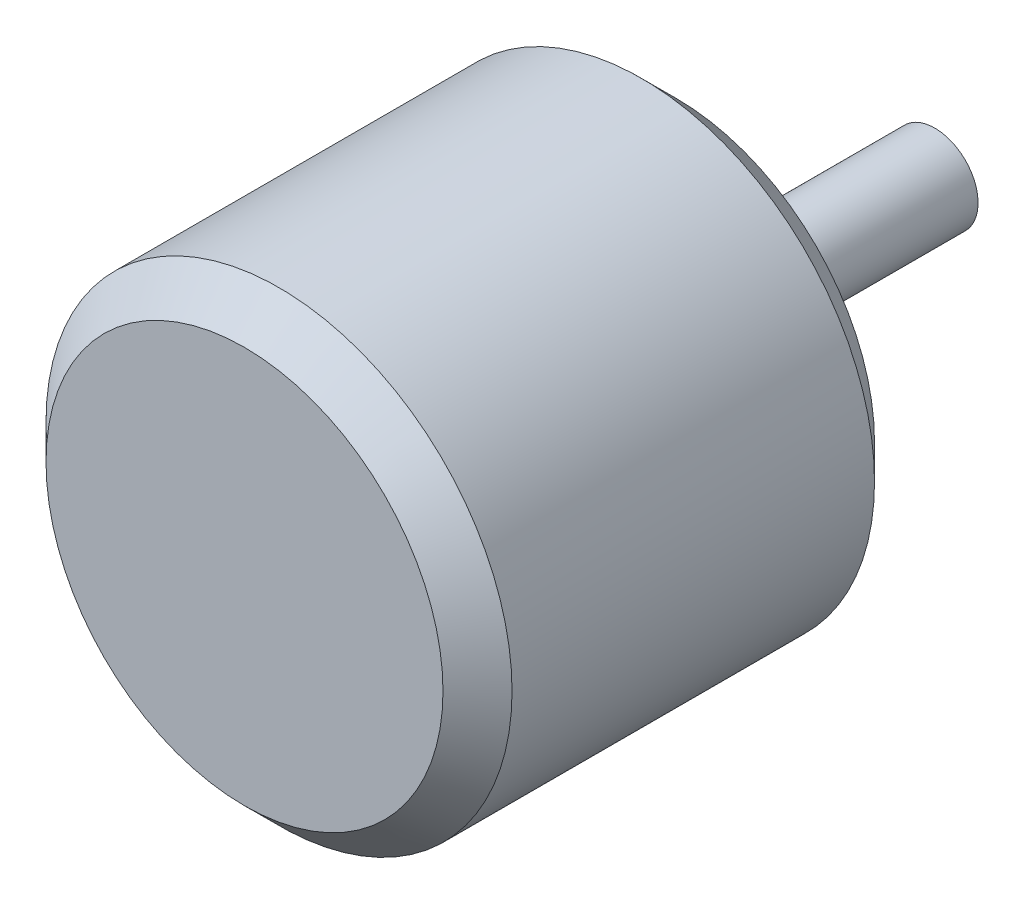
ISO-10303-21;
HEADER;
FILE_DESCRIPTION(('STEP AP214'),'2;1');
FILE_NAME('part.step','',(''),(''),'','','');
FILE_SCHEMA(('AUTOMOTIVE_DESIGN { 1 0 10303 214 1 1 1 1 }'));
ENDSEC;
DATA;
#1=APPLICATION_CONTEXT('core data for automotive mechanical design processes');
#2=APPLICATION_PROTOCOL_DEFINITION('international standard','automotive_design',2000,#1);
#3=PRODUCT_CONTEXT('',#1,'mechanical');
#4=PRODUCT('Part','Part','',(#3));
#5=PRODUCT_RELATED_PRODUCT_CATEGORY('part','',(#4));
#6=PRODUCT_DEFINITION_FORMATION('','',#4);
#7=PRODUCT_DEFINITION_CONTEXT('part definition',#1,'design');
#8=PRODUCT_DEFINITION('design','',#6,#7);
#9=PRODUCT_DEFINITION_SHAPE('','',#8);
#10=(LENGTH_UNIT() NAMED_UNIT(*) SI_UNIT(.MILLI.,.METRE.));
#11=(NAMED_UNIT(*) PLANE_ANGLE_UNIT() SI_UNIT($,.RADIAN.));
#12=(NAMED_UNIT(*) SI_UNIT($,.STERADIAN.) SOLID_ANGLE_UNIT());
#13=UNCERTAINTY_MEASURE_WITH_UNIT(LENGTH_MEASURE(1.E-05),#10,'distance_accuracy_value','');
#14=(GEOMETRIC_REPRESENTATION_CONTEXT(3) GLOBAL_UNCERTAINTY_ASSIGNED_CONTEXT((#13)) GLOBAL_UNIT_ASSIGNED_CONTEXT((#10,
#11,#12)) REPRESENTATION_CONTEXT('',''));
#15=CARTESIAN_POINT('',(0.,0.,0.));
#16=DIRECTION('',(0.,0.,1.));
#17=DIRECTION('',(1.,0.,0.));
#18=AXIS2_PLACEMENT_3D('',#15,#16,#17);
#19=CARTESIAN_POINT('',(0.,0.,25.));
#20=DIRECTION('',(0.,0.,-1.));
#21=DIRECTION('',(-1.,0.,0.));
#22=AXIS2_PLACEMENT_3D('',#19,#20,#21);
#23=CYLINDRICAL_SURFACE('',#22,13.5);
#24=CARTESIAN_POINT('',(0.,0.,23.));
#25=DIRECTION('',(0.,0.,1.));
#26=DIRECTION('',(1.,0.,0.));
#27=AXIS2_PLACEMENT_3D('',#24,#25,#26);
#28=CIRCLE('',#27,13.5);
#29=CARTESIAN_POINT('',(13.5,0.,23.));
#30=VERTEX_POINT('',#29);
#31=EDGE_CURVE('E43',#30,#30,#28,.F.);
#32=ORIENTED_EDGE('',*,*,#31,.T.);
#33=EDGE_LOOP('',(#32));
#34=FACE_BOUND('',#33,.T.);
#35=CARTESIAN_POINT('',(0.,0.,2.));
#36=DIRECTION('',(0.,0.,1.));
#37=DIRECTION('',(1.,0.,0.));
#38=AXIS2_PLACEMENT_3D('',#35,#36,#37);
#39=CIRCLE('',#38,13.5);
#40=CARTESIAN_POINT('',(13.5,0.,2.));
#41=VERTEX_POINT('',#40);
#42=EDGE_CURVE('E50',#41,#41,#39,.T.);
#43=ORIENTED_EDGE('',*,*,#42,.T.);
#44=EDGE_LOOP('',(#43));
#45=FACE_BOUND('',#44,.T.);
#46=ADVANCED_FACE('F31',(#34,#45),#23,.T.);
#47=CARTESIAN_POINT('',(0.,0.,25.));
#48=DIRECTION('',(0.,0.,1.));
#49=DIRECTION('',(1.,0.,0.));
#50=AXIS2_PLACEMENT_3D('',#47,#48,#49);
#51=PLANE('',#50);
#52=CARTESIAN_POINT('',(0.,0.,25.));
#53=DIRECTION('',(0.,0.,1.));
#54=DIRECTION('',(1.,0.,0.));
#55=AXIS2_PLACEMENT_3D('',#52,#53,#54);
#56=CIRCLE('',#55,11.5);
#57=CARTESIAN_POINT('',(11.5,0.,25.));
#58=VERTEX_POINT('',#57);
#59=EDGE_CURVE('E47',#58,#58,#56,.T.);
#60=ORIENTED_EDGE('',*,*,#59,.T.);
#61=EDGE_LOOP('',(#60));
#62=FACE_BOUND('',#61,.T.);
#63=ADVANCED_FACE('F63',(#62),#51,.T.);
#64=CARTESIAN_POINT('',(0.,0.,0.));
#65=DIRECTION('',(0.,0.,1.));
#66=DIRECTION('',(1.,0.,0.));
#67=AXIS2_PLACEMENT_3D('',#64,#65,#66);
#68=PLANE('',#67);
#69=CARTESIAN_POINT('',(0.,0.,0.));
#70=DIRECTION('',(0.,0.,-1.));
#71=DIRECTION('',(-1.,0.,0.));
#72=AXIS2_PLACEMENT_3D('',#69,#70,#71);
#73=CIRCLE('',#72,2.5);
#74=CARTESIAN_POINT('',(-2.5,0.,0.));
#75=VERTEX_POINT('',#74);
#76=EDGE_CURVE('E10',#75,#75,#73,.T.);
#77=ORIENTED_EDGE('',*,*,#76,.F.);
#78=EDGE_LOOP('',(#77));
#79=FACE_BOUND('',#78,.T.);
#80=CARTESIAN_POINT('',(0.,0.,0.));
#81=DIRECTION('',(0.,0.,1.));
#82=DIRECTION('',(1.,0.,0.));
#83=AXIS2_PLACEMENT_3D('',#80,#81,#82);
#84=CIRCLE('',#83,11.5);
#85=CARTESIAN_POINT('',(11.5,0.,0.));
#86=VERTEX_POINT('',#85);
#87=EDGE_CURVE('E35',#86,#86,#84,.F.);
#88=ORIENTED_EDGE('',*,*,#87,.T.);
#89=EDGE_LOOP('',(#88));
#90=FACE_BOUND('',#89,.T.);
#91=ADVANCED_FACE('F60',(#79,#90),#68,.F.);
#92=CARTESIAN_POINT('',(0.,0.,25.));
#93=DIRECTION('',(0.,0.,-1.));
#94=DIRECTION('',(-1.,0.,0.));
#95=AXIS2_PLACEMENT_3D('',#92,#93,#94);
#96=CONICAL_SURFACE('',#95,11.5,0.785398163397447);
#97=ORIENTED_EDGE('',*,*,#31,.F.);
#98=EDGE_LOOP('',(#97));
#99=FACE_BOUND('',#98,.T.);
#100=ORIENTED_EDGE('',*,*,#59,.F.);
#101=EDGE_LOOP('',(#100));
#102=FACE_BOUND('',#101,.T.);
#103=ADVANCED_FACE('F57',(#99,#102),#96,.T.);
#104=CARTESIAN_POINT('',(0.,0.,2.));
#105=DIRECTION('',(0.,0.,1.));
#106=DIRECTION('',(1.,0.,0.));
#107=AXIS2_PLACEMENT_3D('',#104,#105,#106);
#108=CONICAL_SURFACE('',#107,13.5,0.78539816339745);
#109=ORIENTED_EDGE('',*,*,#87,.F.);
#110=EDGE_LOOP('',(#109));
#111=FACE_BOUND('',#110,.T.);
#112=ORIENTED_EDGE('',*,*,#42,.F.);
#113=EDGE_LOOP('',(#112));
#114=FACE_BOUND('',#113,.T.);
#115=ADVANCED_FACE('F33',(#111,#114),#108,.T.);
#116=CARTESIAN_POINT('',(0.,0.,-15.));
#117=DIRECTION('',(0.,0.,1.));
#118=DIRECTION('',(1.,0.,0.));
#119=AXIS2_PLACEMENT_3D('',#116,#117,#118);
#120=CYLINDRICAL_SURFACE('',#119,2.5);
#121=CARTESIAN_POINT('',(0.,0.,-15.));
#122=DIRECTION('',(0.,0.,-1.));
#123=DIRECTION('',(-1.,0.,0.));
#124=AXIS2_PLACEMENT_3D('',#121,#122,#123);
#125=CIRCLE('',#124,2.5);
#126=CARTESIAN_POINT('',(-2.5,0.,-15.));
#127=VERTEX_POINT('',#126);
#128=EDGE_CURVE('E46',#127,#127,#125,.T.);
#129=ORIENTED_EDGE('',*,*,#128,.F.);
#130=EDGE_LOOP('',(#129));
#131=FACE_BOUND('',#130,.T.);
#132=ORIENTED_EDGE('',*,*,#76,.T.);
#133=EDGE_LOOP('',(#132));
#134=FACE_BOUND('',#133,.T.);
#135=ADVANCED_FACE('F74',(#131,#134),#120,.T.);
#136=CARTESIAN_POINT('',(0.,0.,-15.));
#137=DIRECTION('',(0.,0.,-1.));
#138=DIRECTION('',(-1.,0.,0.));
#139=AXIS2_PLACEMENT_3D('',#136,#137,#138);
#140=PLANE('',#139);
#141=ORIENTED_EDGE('',*,*,#128,.T.);
#142=EDGE_LOOP('',(#141));
#143=FACE_BOUND('',#142,.T.);
#144=ADVANCED_FACE('F77',(#143),#140,.T.);
#145=CLOSED_SHELL('',(#46,#63,#91,#103,#115,#135,#144));
#146=MANIFOLD_SOLID_BREP('B2',#145);
#147=ADVANCED_BREP_SHAPE_REPRESENTATION('',(#18,#146),#14);
#148=SHAPE_DEFINITION_REPRESENTATION(#9,#147);
ENDSEC;
END-ISO-10303-21;
